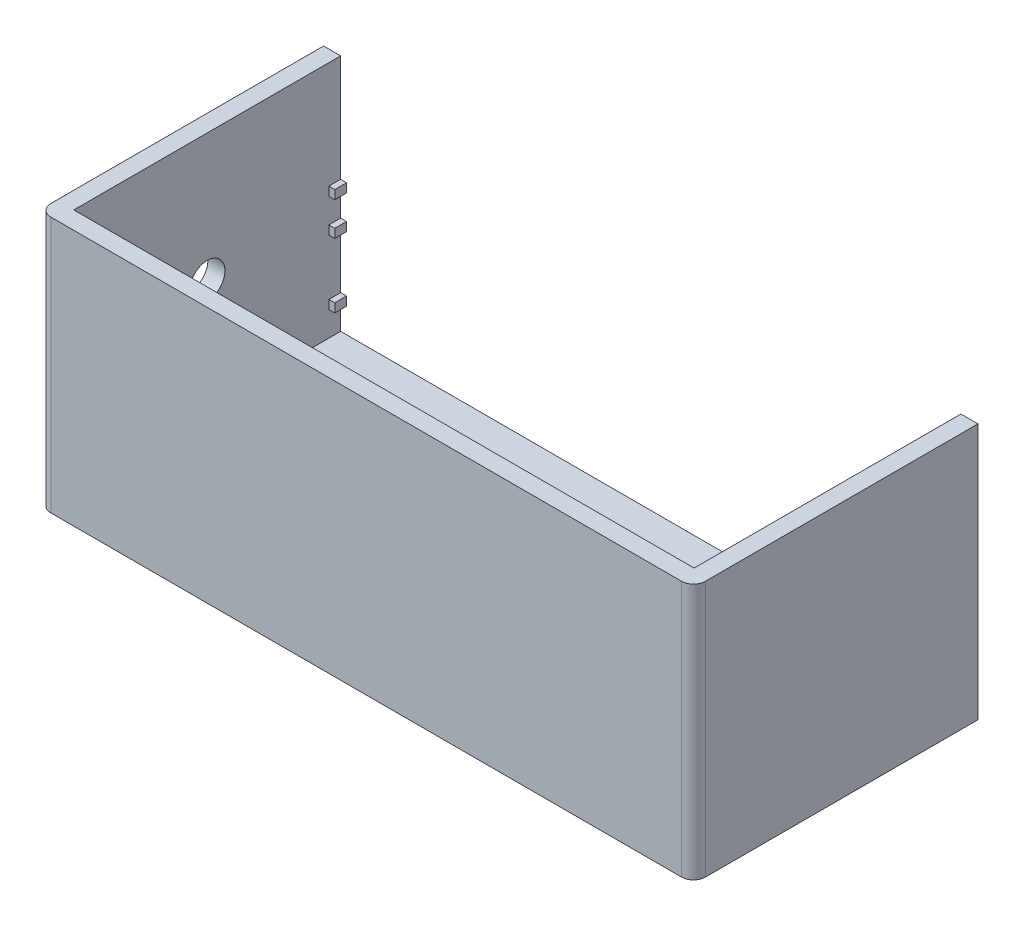
ISO-10303-21;
HEADER;
FILE_DESCRIPTION(('STEP AP214'),'2;1');
FILE_NAME('part.step','',(''),(''),'','','');
FILE_SCHEMA(('AUTOMOTIVE_DESIGN { 1 0 10303 214 1 1 1 1 }'));
ENDSEC;
DATA;
#1=APPLICATION_CONTEXT('core data for automotive mechanical design processes');
#2=APPLICATION_PROTOCOL_DEFINITION('international standard','automotive_design',2000,#1);
#3=PRODUCT_CONTEXT('',#1,'mechanical');
#4=PRODUCT('Part','Part','',(#3));
#5=PRODUCT_RELATED_PRODUCT_CATEGORY('part','',(#4));
#6=PRODUCT_DEFINITION_FORMATION('','',#4);
#7=PRODUCT_DEFINITION_CONTEXT('part definition',#1,'design');
#8=PRODUCT_DEFINITION('design','',#6,#7);
#9=PRODUCT_DEFINITION_SHAPE('','',#8);
#10=(LENGTH_UNIT() NAMED_UNIT(*) SI_UNIT(.MILLI.,.METRE.));
#11=(NAMED_UNIT(*) PLANE_ANGLE_UNIT() SI_UNIT($,.RADIAN.));
#12=(NAMED_UNIT(*) SI_UNIT($,.STERADIAN.) SOLID_ANGLE_UNIT());
#13=UNCERTAINTY_MEASURE_WITH_UNIT(LENGTH_MEASURE(1.E-05),#10,'distance_accuracy_value','');
#14=(GEOMETRIC_REPRESENTATION_CONTEXT(3) GLOBAL_UNCERTAINTY_ASSIGNED_CONTEXT((#13)) GLOBAL_UNIT_ASSIGNED_CONTEXT((#10,
#11,#12)) REPRESENTATION_CONTEXT('',''));
#15=CARTESIAN_POINT('',(0.,0.,0.));
#16=DIRECTION('',(0.,0.,1.));
#17=DIRECTION('',(1.,0.,0.));
#18=AXIS2_PLACEMENT_3D('',#15,#16,#17);
#19=CARTESIAN_POINT('',(52.65,43.5,22.65));
#20=DIRECTION('',(-1.,0.,0.));
#21=DIRECTION('',(0.,0.,1.));
#22=AXIS2_PLACEMENT_3D('',#19,#20,#21);
#23=PLANE('',#22);
#24=DIRECTION('',(0.,-1.,0.));
#25=VECTOR('',#24,1.);
#26=CARTESIAN_POINT('',(52.65,43.5,-22.65));
#27=LINE('',#26,#25);
#28=CARTESIAN_POINT('',(52.65,18.15,-22.65));
#29=VERTEX_POINT('',#28);
#30=CARTESIAN_POINT('',(52.65,8.70000000000002,-22.65));
#31=VERTEX_POINT('',#30);
#32=EDGE_CURVE('E276',#29,#31,#27,.T.);
#33=ORIENTED_EDGE('',*,*,#32,.T.);
#34=DIRECTION('',(0.,0.,-1.));
#35=VECTOR('',#34,1.);
#36=CARTESIAN_POINT('',(52.65,8.70000000000002,-20.65));
#37=LINE('',#36,#35);
#38=CARTESIAN_POINT('',(52.65,8.70000000000002,-20.65));
#39=VERTEX_POINT('',#38);
#40=EDGE_CURVE('E288',#39,#31,#37,.T.);
#41=ORIENTED_EDGE('',*,*,#40,.F.);
#42=DIRECTION('',(0.,-1.,0.));
#43=VECTOR('',#42,1.);
#44=CARTESIAN_POINT('',(52.65,8.70000000000002,-20.65));
#45=LINE('',#44,#43);
#46=CARTESIAN_POINT('',(52.65,7.20000000000001,-20.65));
#47=VERTEX_POINT('',#46);
#48=EDGE_CURVE('E284',#39,#47,#45,.T.);
#49=ORIENTED_EDGE('',*,*,#48,.T.);
#50=DIRECTION('',(0.,0.,-1.));
#51=VECTOR('',#50,1.);
#52=CARTESIAN_POINT('',(52.65,7.20000000000001,-20.65));
#53=LINE('',#52,#51);
#54=CARTESIAN_POINT('',(52.65,7.20000000000001,-22.65));
#55=VERTEX_POINT('',#54);
#56=EDGE_CURVE('E282',#47,#55,#53,.T.);
#57=ORIENTED_EDGE('',*,*,#56,.T.);
#58=CARTESIAN_POINT('',(52.65,3.,-22.65));
#59=VERTEX_POINT('',#58);
#60=EDGE_CURVE('E265',#55,#59,#27,.T.);
#61=ORIENTED_EDGE('',*,*,#60,.T.);
#62=DIRECTION('',(0.,0.,-1.));
#63=VECTOR('',#62,1.);
#64=CARTESIAN_POINT('',(52.65,3.,22.65));
#65=LINE('',#64,#63);
#66=CARTESIAN_POINT('',(52.65,3.,22.65));
#67=VERTEX_POINT('',#66);
#68=EDGE_CURVE('E484',#67,#59,#65,.T.);
#69=ORIENTED_EDGE('',*,*,#68,.F.);
#70=DIRECTION('',(0.,-1.,0.));
#71=VECTOR('',#70,1.);
#72=CARTESIAN_POINT('',(52.65,43.5,22.65));
#73=LINE('',#72,#71);
#74=CARTESIAN_POINT('',(52.65,43.5,22.65));
#75=VERTEX_POINT('',#74);
#76=EDGE_CURVE('E491',#75,#67,#73,.T.);
#77=ORIENTED_EDGE('',*,*,#76,.F.);
#78=DIRECTION('',(0.,0.,-1.));
#79=VECTOR('',#78,1.);
#80=CARTESIAN_POINT('',(52.65,43.5,22.65));
#81=LINE('',#80,#79);
#82=CARTESIAN_POINT('',(52.65,43.5,-22.65));
#83=VERTEX_POINT('',#82);
#84=EDGE_CURVE('E476',#75,#83,#81,.T.);
#85=ORIENTED_EDGE('',*,*,#84,.T.);
#86=CARTESIAN_POINT('',(52.65,25.35,-22.65));
#87=VERTEX_POINT('',#86);
#88=EDGE_CURVE('E280',#83,#87,#27,.T.);
#89=ORIENTED_EDGE('',*,*,#88,.T.);
#90=DIRECTION('',(0.,0.,-1.));
#91=VECTOR('',#90,1.);
#92=CARTESIAN_POINT('',(52.65,25.35,-20.65));
#93=LINE('',#92,#91);
#94=CARTESIAN_POINT('',(52.65,25.35,-20.65));
#95=VERTEX_POINT('',#94);
#96=EDGE_CURVE('E340',#95,#87,#93,.T.);
#97=ORIENTED_EDGE('',*,*,#96,.F.);
#98=DIRECTION('',(0.,1.,0.));
#99=VECTOR('',#98,1.);
#100=CARTESIAN_POINT('',(52.65,0.,-20.65));
#101=LINE('',#100,#99);
#102=CARTESIAN_POINT('',(52.65,23.85,-20.65));
#103=VERTEX_POINT('',#102);
#104=EDGE_CURVE('E366',#103,#95,#101,.T.);
#105=ORIENTED_EDGE('',*,*,#104,.F.);
#106=DIRECTION('',(0.,0.,-1.));
#107=VECTOR('',#106,1.);
#108=CARTESIAN_POINT('',(52.65,23.85,-20.65));
#109=LINE('',#108,#107);
#110=CARTESIAN_POINT('',(52.65,23.85,-22.65));
#111=VERTEX_POINT('',#110);
#112=EDGE_CURVE('E344',#103,#111,#109,.T.);
#113=ORIENTED_EDGE('',*,*,#112,.T.);
#114=CARTESIAN_POINT('',(52.65,19.65,-22.65));
#115=VERTEX_POINT('',#114);
#116=EDGE_CURVE('E279',#111,#115,#27,.T.);
#117=ORIENTED_EDGE('',*,*,#116,.T.);
#118=DIRECTION('',(0.,0.,-1.));
#119=VECTOR('',#118,1.);
#120=CARTESIAN_POINT('',(52.65,19.65,-20.65));
#121=LINE('',#120,#119);
#122=CARTESIAN_POINT('',(52.65,19.65,-20.65));
#123=VERTEX_POINT('',#122);
#124=EDGE_CURVE('E374',#123,#115,#121,.T.);
#125=ORIENTED_EDGE('',*,*,#124,.F.);
#126=DIRECTION('',(0.,1.,0.));
#127=VECTOR('',#126,1.);
#128=CARTESIAN_POINT('',(52.65,0.,-20.65));
#129=LINE('',#128,#127);
#130=CARTESIAN_POINT('',(52.65,18.15,-20.65));
#131=VERTEX_POINT('',#130);
#132=EDGE_CURVE('E394',#131,#123,#129,.T.);
#133=ORIENTED_EDGE('',*,*,#132,.F.);
#134=DIRECTION('',(0.,0.,-1.));
#135=VECTOR('',#134,1.);
#136=CARTESIAN_POINT('',(52.65,18.15,-20.65));
#137=LINE('',#136,#135);
#138=EDGE_CURVE('E377',#131,#29,#137,.T.);
#139=ORIENTED_EDGE('',*,*,#138,.T.);
#140=EDGE_LOOP('',(#33,#41,#49,#57,#61,#69,#77,#85,#89,#97,#105,#113,#117,#125,#133,#139));
#141=FACE_BOUND('',#140,.T.);
#142=ADVANCED_FACE('F40',(#141),#23,.T.);
#143=CARTESIAN_POINT('',(-52.65,43.5,22.65));
#144=DIRECTION('',(1.,0.,0.));
#145=DIRECTION('',(0.,0.,-1.));
#146=AXIS2_PLACEMENT_3D('',#143,#144,#145);
#147=PLANE('',#146);
#148=CARTESIAN_POINT('',(-52.65,21.75,0.));
#149=DIRECTION('',(1.,0.,0.));
#150=DIRECTION('',(0.,0.,-1.));
#151=AXIS2_PLACEMENT_3D('',#148,#149,#150);
#152=CIRCLE('',#151,3.);
#153=CARTESIAN_POINT('',(-52.65,21.75,-3.));
#154=VERTEX_POINT('',#153);
#155=EDGE_CURVE('E944',#154,#154,#152,.T.);
#156=ORIENTED_EDGE('',*,*,#155,.F.);
#157=EDGE_LOOP('',(#156));
#158=FACE_BOUND('',#157,.T.);
#159=DIRECTION('',(0.,0.,-1.));
#160=VECTOR('',#159,1.);
#161=CARTESIAN_POINT('',(-52.65,25.35,-20.65));
#162=LINE('',#161,#160);
#163=CARTESIAN_POINT('',(-52.65,25.35,-20.65));
#164=VERTEX_POINT('',#163);
#165=CARTESIAN_POINT('',(-52.65,25.35,-22.65));
#166=VERTEX_POINT('',#165);
#167=EDGE_CURVE('E306',#164,#166,#162,.T.);
#168=ORIENTED_EDGE('',*,*,#167,.T.);
#169=DIRECTION('',(0.,-1.,0.));
#170=VECTOR('',#169,1.);
#171=CARTESIAN_POINT('',(-52.65,43.5,-22.65));
#172=LINE('',#171,#170);
#173=CARTESIAN_POINT('',(-52.65,43.5,-22.65));
#174=VERTEX_POINT('',#173);
#175=EDGE_CURVE('E277',#174,#166,#172,.T.);
#176=ORIENTED_EDGE('',*,*,#175,.F.);
#177=DIRECTION('',(0.,0.,1.));
#178=VECTOR('',#177,1.);
#179=CARTESIAN_POINT('',(-52.65,43.5,22.65));
#180=LINE('',#179,#178);
#181=CARTESIAN_POINT('',(-52.65,43.5,22.65));
#182=VERTEX_POINT('',#181);
#183=EDGE_CURVE('E472',#174,#182,#180,.T.);
#184=ORIENTED_EDGE('',*,*,#183,.T.);
#185=DIRECTION('',(0.,-1.,0.));
#186=VECTOR('',#185,1.);
#187=CARTESIAN_POINT('',(-52.65,43.5,22.65));
#188=LINE('',#187,#186);
#189=CARTESIAN_POINT('',(-52.65,3.,22.65));
#190=VERTEX_POINT('',#189);
#191=EDGE_CURVE('E494',#182,#190,#188,.T.);
#192=ORIENTED_EDGE('',*,*,#191,.T.);
#193=DIRECTION('',(0.,0.,1.));
#194=VECTOR('',#193,1.);
#195=CARTESIAN_POINT('',(-52.65,3.,22.65));
#196=LINE('',#195,#194);
#197=CARTESIAN_POINT('',(-52.65,3.,-22.65));
#198=VERTEX_POINT('',#197);
#199=EDGE_CURVE('E480',#198,#190,#196,.T.);
#200=ORIENTED_EDGE('',*,*,#199,.F.);
#201=CARTESIAN_POINT('',(-52.65,7.2,-22.65));
#202=VERTEX_POINT('',#201);
#203=EDGE_CURVE('E479',#202,#198,#172,.T.);
#204=ORIENTED_EDGE('',*,*,#203,.F.);
#205=DIRECTION('',(0.,0.,-1.));
#206=VECTOR('',#205,1.);
#207=CARTESIAN_POINT('',(-52.65,7.2,-20.65));
#208=LINE('',#207,#206);
#209=CARTESIAN_POINT('',(-52.65,7.2,-20.65));
#210=VERTEX_POINT('',#209);
#211=EDGE_CURVE('E405',#210,#202,#208,.T.);
#212=ORIENTED_EDGE('',*,*,#211,.F.);
#213=DIRECTION('',(0.,-1.,0.));
#214=VECTOR('',#213,1.);
#215=CARTESIAN_POINT('',(-52.65,0.,-20.65));
#216=LINE('',#215,#214);
#217=CARTESIAN_POINT('',(-52.65,8.7,-20.65));
#218=VERTEX_POINT('',#217);
#219=EDGE_CURVE('E424',#218,#210,#216,.T.);
#220=ORIENTED_EDGE('',*,*,#219,.F.);
#221=DIRECTION('',(0.,0.,-1.));
#222=VECTOR('',#221,1.);
#223=CARTESIAN_POINT('',(-52.65,8.7,-20.65));
#224=LINE('',#223,#222);
#225=CARTESIAN_POINT('',(-52.65,8.7,-22.65));
#226=VERTEX_POINT('',#225);
#227=EDGE_CURVE('E408',#218,#226,#224,.T.);
#228=ORIENTED_EDGE('',*,*,#227,.T.);
#229=CARTESIAN_POINT('',(-52.65,18.15,-22.65));
#230=VERTEX_POINT('',#229);
#231=EDGE_CURVE('E489',#230,#226,#172,.T.);
#232=ORIENTED_EDGE('',*,*,#231,.F.);
#233=DIRECTION('',(0.,0.,-1.));
#234=VECTOR('',#233,1.);
#235=CARTESIAN_POINT('',(-52.65,18.15,-20.65));
#236=LINE('',#235,#234);
#237=CARTESIAN_POINT('',(-52.65,18.15,-20.65));
#238=VERTEX_POINT('',#237);
#239=EDGE_CURVE('E441',#238,#230,#236,.T.);
#240=ORIENTED_EDGE('',*,*,#239,.F.);
#241=DIRECTION('',(0.,-1.,0.));
#242=VECTOR('',#241,1.);
#243=CARTESIAN_POINT('',(-52.65,0.,-20.65));
#244=LINE('',#243,#242);
#245=CARTESIAN_POINT('',(-52.65,19.65,-20.65));
#246=VERTEX_POINT('',#245);
#247=EDGE_CURVE('E434',#246,#238,#244,.T.);
#248=ORIENTED_EDGE('',*,*,#247,.F.);
#249=DIRECTION('',(0.,0.,-1.));
#250=VECTOR('',#249,1.);
#251=CARTESIAN_POINT('',(-52.65,19.65,-20.65));
#252=LINE('',#251,#250);
#253=CARTESIAN_POINT('',(-52.65,19.65,-22.65));
#254=VERTEX_POINT('',#253);
#255=EDGE_CURVE('E455',#246,#254,#252,.T.);
#256=ORIENTED_EDGE('',*,*,#255,.T.);
#257=CARTESIAN_POINT('',(-52.65,23.85,-22.65));
#258=VERTEX_POINT('',#257);
#259=EDGE_CURVE('E488',#258,#254,#172,.T.);
#260=ORIENTED_EDGE('',*,*,#259,.F.);
#261=DIRECTION('',(0.,0.,-1.));
#262=VECTOR('',#261,1.);
#263=CARTESIAN_POINT('',(-52.65,23.85,-20.65));
#264=LINE('',#263,#262);
#265=CARTESIAN_POINT('',(-52.65,23.85,-20.65));
#266=VERTEX_POINT('',#265);
#267=EDGE_CURVE('E316',#266,#258,#264,.T.);
#268=ORIENTED_EDGE('',*,*,#267,.F.);
#269=DIRECTION('',(0.,1.,0.));
#270=VECTOR('',#269,1.);
#271=CARTESIAN_POINT('',(-52.65,23.85,-20.65));
#272=LINE('',#271,#270);
#273=EDGE_CURVE('E313',#266,#164,#272,.T.);
#274=ORIENTED_EDGE('',*,*,#273,.T.);
#275=EDGE_LOOP('',(#168,#176,#184,#192,#200,#204,#212,#220,#228,#232,#240,#248,#256,#260,#268,#274));
#276=FACE_BOUND('',#275,.T.);
#277=ADVANCED_FACE('F541',(#158,#276),#147,.T.);
#278=CARTESIAN_POINT('',(-55.55,3.,25.65));
#279=DIRECTION('',(1.,0.,0.));
#280=DIRECTION('',(0.,0.,-1.));
#281=AXIS2_PLACEMENT_3D('',#278,#279,#280);
#282=PLANE('',#281);
#283=CARTESIAN_POINT('',(-55.55,21.75,0.));
#284=DIRECTION('',(1.,0.,0.));
#285=DIRECTION('',(0.,0.,-1.));
#286=AXIS2_PLACEMENT_3D('',#283,#284,#285);
#287=CIRCLE('',#286,3.);
#288=CARTESIAN_POINT('',(-55.55,21.75,-3.));
#289=VERTEX_POINT('',#288);
#290=EDGE_CURVE('E44',#289,#289,#287,.T.);
#291=ORIENTED_EDGE('',*,*,#290,.T.);
#292=EDGE_LOOP('',(#291));
#293=FACE_BOUND('',#292,.T.);
#294=DIRECTION('',(0.,0.,1.));
#295=VECTOR('',#294,1.);
#296=CARTESIAN_POINT('',(-55.55,0.,25.65));
#297=LINE('',#296,#295);
#298=CARTESIAN_POINT('',(-55.55,0.,-22.65));
#299=VERTEX_POINT('',#298);
#300=CARTESIAN_POINT('',(-55.55,0.,23.65));
#301=VERTEX_POINT('',#300);
#302=EDGE_CURVE('E503',#299,#301,#297,.T.);
#303=ORIENTED_EDGE('',*,*,#302,.T.);
#304=DIRECTION('',(0.,-1.,0.));
#305=VECTOR('',#304,1.);
#306=CARTESIAN_POINT('',(-55.55,3.,23.65));
#307=LINE('',#306,#305);
#308=CARTESIAN_POINT('',(-55.55,43.5,23.65));
#309=VERTEX_POINT('',#308);
#310=EDGE_CURVE('E64',#301,#309,#307,.F.);
#311=ORIENTED_EDGE('',*,*,#310,.T.);
#312=DIRECTION('',(0.,0.,1.));
#313=VECTOR('',#312,1.);
#314=CARTESIAN_POINT('',(-55.55,43.5,-25.65));
#315=LINE('',#314,#313);
#316=CARTESIAN_POINT('',(-55.55,43.5,-22.65));
#317=VERTEX_POINT('',#316);
#318=EDGE_CURVE('E497',#317,#309,#315,.T.);
#319=ORIENTED_EDGE('',*,*,#318,.F.);
#320=DIRECTION('',(0.,-1.,0.));
#321=VECTOR('',#320,1.);
#322=CARTESIAN_POINT('',(-55.55,3.,-22.65));
#323=LINE('',#322,#321);
#324=EDGE_CURVE('E462',#317,#299,#323,.T.);
#325=ORIENTED_EDGE('',*,*,#324,.T.);
#326=EDGE_LOOP('',(#303,#311,#319,#325));
#327=FACE_BOUND('',#326,.T.);
#328=ADVANCED_FACE('F534',(#293,#327),#282,.F.);
#329=CARTESIAN_POINT('',(55.55,3.,25.65));
#330=DIRECTION('',(0.,0.,-1.));
#331=DIRECTION('',(-1.,0.,0.));
#332=AXIS2_PLACEMENT_3D('',#329,#330,#331);
#333=PLANE('',#332);
#334=DIRECTION('',(1.,0.,0.));
#335=VECTOR('',#334,1.);
#336=CARTESIAN_POINT('',(55.55,43.5,25.65));
#337=LINE('',#336,#335);
#338=CARTESIAN_POINT('',(-53.55,43.5,25.65));
#339=VERTEX_POINT('',#338);
#340=CARTESIAN_POINT('',(53.55,43.5,25.65));
#341=VERTEX_POINT('',#340);
#342=EDGE_CURVE('E499',#339,#341,#337,.T.);
#343=ORIENTED_EDGE('',*,*,#342,.F.);
#344=DIRECTION('',(0.,-1.,0.));
#345=VECTOR('',#344,1.);
#346=CARTESIAN_POINT('',(-53.55,3.,25.65));
#347=LINE('',#346,#345);
#348=CARTESIAN_POINT('',(-53.55,0.,25.65));
#349=VERTEX_POINT('',#348);
#350=EDGE_CURVE('E512',#339,#349,#347,.T.);
#351=ORIENTED_EDGE('',*,*,#350,.T.);
#352=DIRECTION('',(1.,0.,0.));
#353=VECTOR('',#352,1.);
#354=CARTESIAN_POINT('',(55.55,0.,25.65));
#355=LINE('',#354,#353);
#356=CARTESIAN_POINT('',(53.55,0.,25.65));
#357=VERTEX_POINT('',#356);
#358=EDGE_CURVE('E505',#349,#357,#355,.T.);
#359=ORIENTED_EDGE('',*,*,#358,.T.);
#360=DIRECTION('',(0.,-1.,0.));
#361=VECTOR('',#360,1.);
#362=CARTESIAN_POINT('',(53.55,3.,25.65));
#363=LINE('',#362,#361);
#364=EDGE_CURVE('E510',#357,#341,#363,.F.);
#365=ORIENTED_EDGE('',*,*,#364,.T.);
#366=EDGE_LOOP('',(#343,#351,#359,#365));
#367=FACE_BOUND('',#366,.T.);
#368=ADVANCED_FACE('F527',(#367),#333,.F.);
#369=CARTESIAN_POINT('',(55.55,3.,25.65));
#370=DIRECTION('',(-1.,0.,0.));
#371=DIRECTION('',(0.,0.,1.));
#372=AXIS2_PLACEMENT_3D('',#369,#370,#371);
#373=PLANE('',#372);
#374=DIRECTION('',(0.,0.,-1.));
#375=VECTOR('',#374,1.);
#376=CARTESIAN_POINT('',(55.55,43.5,-25.65));
#377=LINE('',#376,#375);
#378=CARTESIAN_POINT('',(55.55,43.5,23.65));
#379=VERTEX_POINT('',#378);
#380=CARTESIAN_POINT('',(55.55,43.5,-22.65));
#381=VERTEX_POINT('',#380);
#382=EDGE_CURVE('E501',#379,#381,#377,.T.);
#383=ORIENTED_EDGE('',*,*,#382,.F.);
#384=DIRECTION('',(0.,-1.,0.));
#385=VECTOR('',#384,1.);
#386=CARTESIAN_POINT('',(55.55,3.,23.65));
#387=LINE('',#386,#385);
#388=CARTESIAN_POINT('',(55.55,0.,23.65));
#389=VERTEX_POINT('',#388);
#390=EDGE_CURVE('E11',#379,#389,#387,.T.);
#391=ORIENTED_EDGE('',*,*,#390,.T.);
#392=DIRECTION('',(0.,0.,-1.));
#393=VECTOR('',#392,1.);
#394=CARTESIAN_POINT('',(55.55,0.,25.65));
#395=LINE('',#394,#393);
#396=CARTESIAN_POINT('',(55.55,0.,-22.65));
#397=VERTEX_POINT('',#396);
#398=EDGE_CURVE('E508',#389,#397,#395,.T.);
#399=ORIENTED_EDGE('',*,*,#398,.T.);
#400=DIRECTION('',(0.,1.,0.));
#401=VECTOR('',#400,1.);
#402=CARTESIAN_POINT('',(55.55,3.,-22.65));
#403=LINE('',#402,#401);
#404=EDGE_CURVE('E469',#397,#381,#403,.T.);
#405=ORIENTED_EDGE('',*,*,#404,.T.);
#406=EDGE_LOOP('',(#383,#391,#399,#405));
#407=FACE_BOUND('',#406,.T.);
#408=ADVANCED_FACE('F614',(#407),#373,.F.);
#409=CARTESIAN_POINT('',(0.,0.,0.));
#410=DIRECTION('',(0.,1.,0.));
#411=DIRECTION('',(0.,0.,1.));
#412=AXIS2_PLACEMENT_3D('',#409,#410,#411);
#413=PLANE('',#412);
#414=ORIENTED_EDGE('',*,*,#358,.F.);
#415=CARTESIAN_POINT('',(-53.55,0.,23.65));
#416=DIRECTION('',(0.,1.,0.));
#417=DIRECTION('',(0.,0.,1.));
#418=AXIS2_PLACEMENT_3D('',#415,#416,#417);
#419=CIRCLE('',#418,2.);
#420=EDGE_CURVE('E517',#349,#301,#419,.F.);
#421=ORIENTED_EDGE('',*,*,#420,.T.);
#422=ORIENTED_EDGE('',*,*,#302,.F.);
#423=DIRECTION('',(1.,0.,0.));
#424=VECTOR('',#423,1.);
#425=CARTESIAN_POINT('',(0.,0.,-22.65));
#426=LINE('',#425,#424);
#427=EDGE_CURVE('E466',#299,#397,#426,.T.);
#428=ORIENTED_EDGE('',*,*,#427,.T.);
#429=ORIENTED_EDGE('',*,*,#398,.F.);
#430=CARTESIAN_POINT('',(53.55,0.,23.65));
#431=DIRECTION('',(0.,1.,0.));
#432=DIRECTION('',(0.,0.,1.));
#433=AXIS2_PLACEMENT_3D('',#430,#431,#432);
#434=CIRCLE('',#433,2.);
#435=EDGE_CURVE('E515',#389,#357,#434,.F.);
#436=ORIENTED_EDGE('',*,*,#435,.T.);
#437=EDGE_LOOP('',(#414,#421,#422,#428,#429,#436));
#438=FACE_BOUND('',#437,.T.);
#439=ADVANCED_FACE('F533',(#438),#413,.F.);
#440=CARTESIAN_POINT('',(0.,43.5,0.));
#441=DIRECTION('',(0.,-1.,0.));
#442=DIRECTION('',(0.,0.,-1.));
#443=AXIS2_PLACEMENT_3D('',#440,#441,#442);
#444=PLANE('',#443);
#445=ORIENTED_EDGE('',*,*,#318,.T.);
#446=CARTESIAN_POINT('',(-53.55,43.5,23.65));
#447=DIRECTION('',(0.,-1.,0.));
#448=DIRECTION('',(0.,0.,-1.));
#449=AXIS2_PLACEMENT_3D('',#446,#447,#448);
#450=CIRCLE('',#449,2.);
#451=EDGE_CURVE('E49',#309,#339,#450,.F.);
#452=ORIENTED_EDGE('',*,*,#451,.T.);
#453=ORIENTED_EDGE('',*,*,#342,.T.);
#454=CARTESIAN_POINT('',(53.55,43.5,23.65));
#455=DIRECTION('',(0.,-1.,0.));
#456=DIRECTION('',(0.,0.,-1.));
#457=AXIS2_PLACEMENT_3D('',#454,#455,#456);
#458=CIRCLE('',#457,2.);
#459=EDGE_CURVE('E56',#341,#379,#458,.F.);
#460=ORIENTED_EDGE('',*,*,#459,.T.);
#461=ORIENTED_EDGE('',*,*,#382,.T.);
#462=DIRECTION('',(-1.,0.,0.));
#463=VECTOR('',#462,1.);
#464=CARTESIAN_POINT('',(0.,43.5,-22.65));
#465=LINE('',#464,#463);
#466=EDGE_CURVE('E463',#381,#83,#465,.T.);
#467=ORIENTED_EDGE('',*,*,#466,.T.);
#468=ORIENTED_EDGE('',*,*,#84,.F.);
#469=DIRECTION('',(1.,0.,0.));
#470=VECTOR('',#469,1.);
#471=CARTESIAN_POINT('',(52.65,43.5,22.65));
#472=LINE('',#471,#470);
#473=EDGE_CURVE('E474',#182,#75,#472,.T.);
#474=ORIENTED_EDGE('',*,*,#473,.F.);
#475=ORIENTED_EDGE('',*,*,#183,.F.);
#476=EDGE_CURVE('E451',#174,#317,#465,.T.);
#477=ORIENTED_EDGE('',*,*,#476,.T.);
#478=EDGE_LOOP('',(#445,#452,#453,#460,#461,#467,#468,#474,#475,#477));
#479=FACE_BOUND('',#478,.T.);
#480=ADVANCED_FACE('F523',(#479),#444,.F.);
#481=CARTESIAN_POINT('',(52.65,43.5,22.65));
#482=DIRECTION('',(0.,0.,-1.));
#483=DIRECTION('',(-1.,0.,0.));
#484=AXIS2_PLACEMENT_3D('',#481,#482,#483);
#485=PLANE('',#484);
#486=DIRECTION('',(1.,0.,0.));
#487=VECTOR('',#486,1.);
#488=CARTESIAN_POINT('',(52.65,3.,22.65));
#489=LINE('',#488,#487);
#490=EDGE_CURVE('E482',#190,#67,#489,.T.);
#491=ORIENTED_EDGE('',*,*,#490,.F.);
#492=ORIENTED_EDGE('',*,*,#191,.F.);
#493=ORIENTED_EDGE('',*,*,#473,.T.);
#494=ORIENTED_EDGE('',*,*,#76,.T.);
#495=EDGE_LOOP('',(#491,#492,#493,#494));
#496=FACE_BOUND('',#495,.T.);
#497=ADVANCED_FACE('F545',(#496),#485,.T.);
#498=CARTESIAN_POINT('',(0.,3.,0.));
#499=DIRECTION('',(0.,1.,0.));
#500=DIRECTION('',(0.,0.,1.));
#501=AXIS2_PLACEMENT_3D('',#498,#499,#500);
#502=PLANE('',#501);
#503=ORIENTED_EDGE('',*,*,#199,.T.);
#504=ORIENTED_EDGE('',*,*,#490,.T.);
#505=ORIENTED_EDGE('',*,*,#68,.T.);
#506=DIRECTION('',(-1.,0.,0.));
#507=VECTOR('',#506,1.);
#508=CARTESIAN_POINT('',(52.65,3.,-22.65));
#509=LINE('',#508,#507);
#510=EDGE_CURVE('E272',#59,#198,#509,.T.);
#511=ORIENTED_EDGE('',*,*,#510,.T.);
#512=EDGE_LOOP('',(#503,#504,#505,#511));
#513=FACE_BOUND('',#512,.T.);
#514=ADVANCED_FACE('F548',(#513),#502,.T.);
#515=CARTESIAN_POINT('',(0.,0.,-22.65));
#516=DIRECTION('',(0.,0.,1.));
#517=DIRECTION('',(1.,0.,0.));
#518=AXIS2_PLACEMENT_3D('',#515,#516,#517);
#519=PLANE('',#518);
#520=ORIENTED_EDGE('',*,*,#404,.F.);
#521=ORIENTED_EDGE('',*,*,#427,.F.);
#522=ORIENTED_EDGE('',*,*,#324,.F.);
#523=ORIENTED_EDGE('',*,*,#476,.F.);
#524=ORIENTED_EDGE('',*,*,#175,.T.);
#525=DIRECTION('',(1.,0.,0.));
#526=VECTOR('',#525,1.);
#527=CARTESIAN_POINT('',(-52.65,25.35,-22.65));
#528=LINE('',#527,#526);
#529=CARTESIAN_POINT('',(-51.65,25.35,-22.65));
#530=VERTEX_POINT('',#529);
#531=EDGE_CURVE('E327',#166,#530,#528,.T.);
#532=ORIENTED_EDGE('',*,*,#531,.T.);
#533=DIRECTION('',(0.,-1.,0.));
#534=VECTOR('',#533,1.);
#535=CARTESIAN_POINT('',(-51.65,25.35,-22.65));
#536=LINE('',#535,#534);
#537=CARTESIAN_POINT('',(-51.65,23.85,-22.65));
#538=VERTEX_POINT('',#537);
#539=EDGE_CURVE('E323',#530,#538,#536,.T.);
#540=ORIENTED_EDGE('',*,*,#539,.T.);
#541=DIRECTION('',(-1.,0.,0.));
#542=VECTOR('',#541,1.);
#543=CARTESIAN_POINT('',(-51.65,23.85,-22.65));
#544=LINE('',#543,#542);
#545=EDGE_CURVE('E321',#538,#258,#544,.T.);
#546=ORIENTED_EDGE('',*,*,#545,.T.);
#547=ORIENTED_EDGE('',*,*,#259,.T.);
#548=DIRECTION('',(-1.,0.,0.));
#549=VECTOR('',#548,1.);
#550=CARTESIAN_POINT('',(0.,19.65,-22.65));
#551=LINE('',#550,#549);
#552=CARTESIAN_POINT('',(-51.65,19.65,-22.65));
#553=VERTEX_POINT('',#552);
#554=EDGE_CURVE('E444',#553,#254,#551,.T.);
#555=ORIENTED_EDGE('',*,*,#554,.F.);
#556=DIRECTION('',(0.,1.,0.));
#557=VECTOR('',#556,1.);
#558=CARTESIAN_POINT('',(-51.65,0.,-22.65));
#559=LINE('',#558,#557);
#560=CARTESIAN_POINT('',(-51.65,18.15,-22.65));
#561=VERTEX_POINT('',#560);
#562=EDGE_CURVE('E435',#561,#553,#559,.T.);
#563=ORIENTED_EDGE('',*,*,#562,.F.);
#564=DIRECTION('',(1.,0.,0.));
#565=VECTOR('',#564,1.);
#566=CARTESIAN_POINT('',(0.,18.15,-22.65));
#567=LINE('',#566,#565);
#568=EDGE_CURVE('E421',#230,#561,#567,.T.);
#569=ORIENTED_EDGE('',*,*,#568,.F.);
#570=ORIENTED_EDGE('',*,*,#231,.T.);
#571=DIRECTION('',(1.,0.,0.));
#572=VECTOR('',#571,1.);
#573=CARTESIAN_POINT('',(0.,8.69999999999982,-22.65));
#574=LINE('',#573,#572);
#575=CARTESIAN_POINT('',(-51.65,8.7,-22.65));
#576=VERTEX_POINT('',#575);
#577=EDGE_CURVE('E412',#226,#576,#574,.T.);
#578=ORIENTED_EDGE('',*,*,#577,.T.);
#579=DIRECTION('',(0.,-1.,0.));
#580=VECTOR('',#579,1.);
#581=CARTESIAN_POINT('',(-51.65,-2.38929246757872E-13,-22.65));
#582=LINE('',#581,#580);
#583=CARTESIAN_POINT('',(-51.65,7.2,-22.65));
#584=VERTEX_POINT('',#583);
#585=EDGE_CURVE('E418',#576,#584,#582,.T.);
#586=ORIENTED_EDGE('',*,*,#585,.T.);
#587=DIRECTION('',(-1.,0.,0.));
#588=VECTOR('',#587,1.);
#589=CARTESIAN_POINT('',(0.,7.20000000000018,-22.65));
#590=LINE('',#589,#588);
#591=EDGE_CURVE('E415',#584,#202,#590,.T.);
#592=ORIENTED_EDGE('',*,*,#591,.T.);
#593=ORIENTED_EDGE('',*,*,#203,.T.);
#594=ORIENTED_EDGE('',*,*,#510,.F.);
#595=ORIENTED_EDGE('',*,*,#60,.F.);
#596=DIRECTION('',(1.,0.,0.));
#597=VECTOR('',#596,1.);
#598=CARTESIAN_POINT('',(51.65,7.20000000000002,-22.65));
#599=LINE('',#598,#597);
#600=CARTESIAN_POINT('',(51.65,7.20000000000002,-22.65));
#601=VERTEX_POINT('',#600);
#602=EDGE_CURVE('E270',#601,#55,#599,.T.);
#603=ORIENTED_EDGE('',*,*,#602,.F.);
#604=DIRECTION('',(0.,-1.,0.));
#605=VECTOR('',#604,1.);
#606=CARTESIAN_POINT('',(51.65,8.70000000000002,-22.65));
#607=LINE('',#606,#605);
#608=CARTESIAN_POINT('',(51.65,8.70000000000002,-22.65));
#609=VERTEX_POINT('',#608);
#610=EDGE_CURVE('E294',#609,#601,#607,.T.);
#611=ORIENTED_EDGE('',*,*,#610,.F.);
#612=DIRECTION('',(-1.,0.,0.));
#613=VECTOR('',#612,1.);
#614=CARTESIAN_POINT('',(52.65,8.70000000000002,-22.65));
#615=LINE('',#614,#613);
#616=EDGE_CURVE('E297',#31,#609,#615,.T.);
#617=ORIENTED_EDGE('',*,*,#616,.F.);
#618=ORIENTED_EDGE('',*,*,#32,.F.);
#619=DIRECTION('',(-1.,0.,0.));
#620=VECTOR('',#619,1.);
#621=CARTESIAN_POINT('',(0.,18.15,-22.65));
#622=LINE('',#621,#620);
#623=CARTESIAN_POINT('',(51.65,18.15,-22.65));
#624=VERTEX_POINT('',#623);
#625=EDGE_CURVE('E381',#29,#624,#622,.T.);
#626=ORIENTED_EDGE('',*,*,#625,.T.);
#627=DIRECTION('',(0.,1.,0.));
#628=VECTOR('',#627,1.);
#629=CARTESIAN_POINT('',(51.65,0.,-22.65));
#630=LINE('',#629,#628);
#631=CARTESIAN_POINT('',(51.65,19.65,-22.65));
#632=VERTEX_POINT('',#631);
#633=EDGE_CURVE('E388',#624,#632,#630,.T.);
#634=ORIENTED_EDGE('',*,*,#633,.T.);
#635=DIRECTION('',(1.,0.,0.));
#636=VECTOR('',#635,1.);
#637=CARTESIAN_POINT('',(0.,19.65,-22.65));
#638=LINE('',#637,#636);
#639=EDGE_CURVE('E384',#632,#115,#638,.T.);
#640=ORIENTED_EDGE('',*,*,#639,.T.);
#641=ORIENTED_EDGE('',*,*,#116,.F.);
#642=DIRECTION('',(1.,0.,0.));
#643=VECTOR('',#642,1.);
#644=CARTESIAN_POINT('',(0.,23.85,-22.65));
#645=LINE('',#644,#643);
#646=CARTESIAN_POINT('',(51.65,23.85,-22.65));
#647=VERTEX_POINT('',#646);
#648=EDGE_CURVE('E354',#647,#111,#645,.T.);
#649=ORIENTED_EDGE('',*,*,#648,.F.);
#650=DIRECTION('',(0.,-1.,0.));
#651=VECTOR('',#650,1.);
#652=CARTESIAN_POINT('',(51.65,0.,-22.65));
#653=LINE('',#652,#651);
#654=CARTESIAN_POINT('',(51.65,25.35,-22.65));
#655=VERTEX_POINT('',#654);
#656=EDGE_CURVE('E352',#655,#647,#653,.T.);
#657=ORIENTED_EDGE('',*,*,#656,.F.);
#658=DIRECTION('',(-1.,0.,0.));
#659=VECTOR('',#658,1.);
#660=CARTESIAN_POINT('',(0.,25.35,-22.65));
#661=LINE('',#660,#659);
#662=EDGE_CURVE('E358',#87,#655,#661,.T.);
#663=ORIENTED_EDGE('',*,*,#662,.F.);
#664=ORIENTED_EDGE('',*,*,#88,.F.);
#665=ORIENTED_EDGE('',*,*,#466,.F.);
#666=EDGE_LOOP('',(#520,#521,#522,#523,#524,#532,#540,#546,#547,#555,#563,#569,#570,#578,#586,
#592,#593,#594,#595,#603,#611,#617,#618,#626,#634,#640,#641,#649,#657,#663,#664,#665));
#667=FACE_BOUND('',#666,.T.);
#668=ADVANCED_FACE('F268',(#667),#519,.F.);
#669=CARTESIAN_POINT('',(0.,18.15,-20.65));
#670=DIRECTION('',(0.,1.,0.));
#671=DIRECTION('',(0.,0.,1.));
#672=AXIS2_PLACEMENT_3D('',#669,#670,#671);
#673=PLANE('',#672);
#674=ORIENTED_EDGE('',*,*,#568,.T.);
#675=DIRECTION('',(0.,0.,-1.));
#676=VECTOR('',#675,1.);
#677=CARTESIAN_POINT('',(-51.65,18.15,-20.65));
#678=LINE('',#677,#676);
#679=CARTESIAN_POINT('',(-51.65,18.15,-20.65));
#680=VERTEX_POINT('',#679);
#681=EDGE_CURVE('E448',#680,#561,#678,.T.);
#682=ORIENTED_EDGE('',*,*,#681,.F.);
#683=DIRECTION('',(1.,0.,0.));
#684=VECTOR('',#683,1.);
#685=CARTESIAN_POINT('',(0.,18.15,-20.65));
#686=LINE('',#685,#684);
#687=EDGE_CURVE('E431',#238,#680,#686,.T.);
#688=ORIENTED_EDGE('',*,*,#687,.F.);
#689=ORIENTED_EDGE('',*,*,#239,.T.);
#690=EDGE_LOOP('',(#674,#682,#688,#689));
#691=FACE_BOUND('',#690,.T.);
#692=ADVANCED_FACE('F570',(#691),#673,.F.);
#693=CARTESIAN_POINT('',(-51.65,0.,-20.65));
#694=DIRECTION('',(-1.,0.,0.));
#695=DIRECTION('',(0.,0.,1.));
#696=AXIS2_PLACEMENT_3D('',#693,#694,#695);
#697=PLANE('',#696);
#698=ORIENTED_EDGE('',*,*,#562,.T.);
#699=DIRECTION('',(0.,0.,-1.));
#700=VECTOR('',#699,1.);
#701=CARTESIAN_POINT('',(-51.65,19.65,-20.65));
#702=LINE('',#701,#700);
#703=CARTESIAN_POINT('',(-51.65,19.65,-20.65));
#704=VERTEX_POINT('',#703);
#705=EDGE_CURVE('E452',#704,#553,#702,.T.);
#706=ORIENTED_EDGE('',*,*,#705,.F.);
#707=DIRECTION('',(0.,1.,0.));
#708=VECTOR('',#707,1.);
#709=CARTESIAN_POINT('',(-51.65,0.,-20.65));
#710=LINE('',#709,#708);
#711=EDGE_CURVE('E439',#680,#704,#710,.T.);
#712=ORIENTED_EDGE('',*,*,#711,.F.);
#713=ORIENTED_EDGE('',*,*,#681,.T.);
#714=EDGE_LOOP('',(#698,#706,#712,#713));
#715=FACE_BOUND('',#714,.T.);
#716=ADVANCED_FACE('F572',(#715),#697,.F.);
#717=CARTESIAN_POINT('',(0.,19.65,-20.65));
#718=DIRECTION('',(0.,-1.,0.));
#719=DIRECTION('',(0.,0.,-1.));
#720=AXIS2_PLACEMENT_3D('',#717,#718,#719);
#721=PLANE('',#720);
#722=ORIENTED_EDGE('',*,*,#554,.T.);
#723=ORIENTED_EDGE('',*,*,#255,.F.);
#724=DIRECTION('',(-1.,0.,0.));
#725=VECTOR('',#724,1.);
#726=CARTESIAN_POINT('',(0.,19.65,-20.65));
#727=LINE('',#726,#725);
#728=EDGE_CURVE('E437',#704,#246,#727,.T.);
#729=ORIENTED_EDGE('',*,*,#728,.F.);
#730=ORIENTED_EDGE('',*,*,#705,.T.);
#731=EDGE_LOOP('',(#722,#723,#729,#730));
#732=FACE_BOUND('',#731,.T.);
#733=ADVANCED_FACE('F559',(#732),#721,.F.);
#734=CARTESIAN_POINT('',(0.,0.,-20.65));
#735=DIRECTION('',(0.,0.,-1.));
#736=DIRECTION('',(-1.,0.,0.));
#737=AXIS2_PLACEMENT_3D('',#734,#735,#736);
#738=PLANE('',#737);
#739=ORIENTED_EDGE('',*,*,#687,.T.);
#740=ORIENTED_EDGE('',*,*,#711,.T.);
#741=ORIENTED_EDGE('',*,*,#728,.T.);
#742=ORIENTED_EDGE('',*,*,#247,.T.);
#743=EDGE_LOOP('',(#739,#740,#741,#742));
#744=FACE_BOUND('',#743,.T.);
#745=ADVANCED_FACE('F567',(#744),#738,.F.);
#746=CARTESIAN_POINT('',(-51.65,-2.38929246757872E-13,-20.65));
#747=DIRECTION('',(1.,0.,0.));
#748=DIRECTION('',(0.,1.,0.));
#749=AXIS2_PLACEMENT_3D('',#746,#747,#748);
#750=PLANE('',#749);
#751=ORIENTED_EDGE('',*,*,#585,.F.);
#752=DIRECTION('',(0.,0.,-1.));
#753=VECTOR('',#752,1.);
#754=CARTESIAN_POINT('',(-51.65,8.7,-20.65));
#755=LINE('',#754,#753);
#756=CARTESIAN_POINT('',(-51.65,8.7,-20.65));
#757=VERTEX_POINT('',#756);
#758=EDGE_CURVE('E391',#757,#576,#755,.T.);
#759=ORIENTED_EDGE('',*,*,#758,.F.);
#760=DIRECTION('',(0.,-1.,0.));
#761=VECTOR('',#760,1.);
#762=CARTESIAN_POINT('',(-51.65,-2.38929246757872E-13,-20.65));
#763=LINE('',#762,#761);
#764=CARTESIAN_POINT('',(-51.65,7.2,-20.65));
#765=VERTEX_POINT('',#764);
#766=EDGE_CURVE('E416',#757,#765,#763,.T.);
#767=ORIENTED_EDGE('',*,*,#766,.T.);
#768=DIRECTION('',(0.,0.,-1.));
#769=VECTOR('',#768,1.);
#770=CARTESIAN_POINT('',(-51.65,7.2,-20.65));
#771=LINE('',#770,#769);
#772=EDGE_CURVE('E402',#765,#584,#771,.T.);
#773=ORIENTED_EDGE('',*,*,#772,.T.);
#774=EDGE_LOOP('',(#751,#759,#767,#773));
#775=FACE_BOUND('',#774,.T.);
#776=ADVANCED_FACE('F582',(#775),#750,.T.);
#777=CARTESIAN_POINT('',(0.,8.69999999999982,-20.65));
#778=DIRECTION('',(0.,1.,0.));
#779=DIRECTION('',(-1.,0.,0.));
#780=AXIS2_PLACEMENT_3D('',#777,#778,#779);
#781=PLANE('',#780);
#782=ORIENTED_EDGE('',*,*,#577,.F.);
#783=ORIENTED_EDGE('',*,*,#227,.F.);
#784=DIRECTION('',(1.,0.,0.));
#785=VECTOR('',#784,1.);
#786=CARTESIAN_POINT('',(0.,8.69999999999982,-20.65));
#787=LINE('',#786,#785);
#788=EDGE_CURVE('E404',#218,#757,#787,.T.);
#789=ORIENTED_EDGE('',*,*,#788,.T.);
#790=ORIENTED_EDGE('',*,*,#758,.T.);
#791=EDGE_LOOP('',(#782,#783,#789,#790));
#792=FACE_BOUND('',#791,.T.);
#793=ADVANCED_FACE('F575',(#792),#781,.T.);
#794=CARTESIAN_POINT('',(0.,7.20000000000018,-20.65));
#795=DIRECTION('',(0.,-1.,0.));
#796=DIRECTION('',(1.,0.,0.));
#797=AXIS2_PLACEMENT_3D('',#794,#795,#796);
#798=PLANE('',#797);
#799=ORIENTED_EDGE('',*,*,#591,.F.);
#800=ORIENTED_EDGE('',*,*,#772,.F.);
#801=DIRECTION('',(-1.,0.,0.));
#802=VECTOR('',#801,1.);
#803=CARTESIAN_POINT('',(0.,7.20000000000018,-20.65));
#804=LINE('',#803,#802);
#805=EDGE_CURVE('E426',#765,#210,#804,.T.);
#806=ORIENTED_EDGE('',*,*,#805,.T.);
#807=ORIENTED_EDGE('',*,*,#211,.T.);
#808=EDGE_LOOP('',(#799,#800,#806,#807));
#809=FACE_BOUND('',#808,.T.);
#810=ADVANCED_FACE('F585',(#809),#798,.T.);
#811=CARTESIAN_POINT('',(0.,0.,-20.65));
#812=DIRECTION('',(0.,0.,-1.));
#813=DIRECTION('',(-1.,0.,0.));
#814=AXIS2_PLACEMENT_3D('',#811,#812,#813);
#815=PLANE('',#814);
#816=ORIENTED_EDGE('',*,*,#766,.F.);
#817=ORIENTED_EDGE('',*,*,#788,.F.);
#818=ORIENTED_EDGE('',*,*,#219,.T.);
#819=ORIENTED_EDGE('',*,*,#805,.F.);
#820=EDGE_LOOP('',(#816,#817,#818,#819));
#821=FACE_BOUND('',#820,.T.);
#822=ADVANCED_FACE('F578',(#821),#815,.F.);
#823=CARTESIAN_POINT('',(51.65,0.,-20.65));
#824=DIRECTION('',(-1.,0.,0.));
#825=DIRECTION('',(0.,0.,1.));
#826=AXIS2_PLACEMENT_3D('',#823,#824,#825);
#827=PLANE('',#826);
#828=ORIENTED_EDGE('',*,*,#633,.F.);
#829=DIRECTION('',(0.,0.,-1.));
#830=VECTOR('',#829,1.);
#831=CARTESIAN_POINT('',(51.65,18.15,-20.65));
#832=LINE('',#831,#830);
#833=CARTESIAN_POINT('',(51.65,18.15,-20.65));
#834=VERTEX_POINT('',#833);
#835=EDGE_CURVE('E361',#834,#624,#832,.T.);
#836=ORIENTED_EDGE('',*,*,#835,.F.);
#837=DIRECTION('',(0.,1.,0.));
#838=VECTOR('',#837,1.);
#839=CARTESIAN_POINT('',(51.65,0.,-20.65));
#840=LINE('',#839,#838);
#841=CARTESIAN_POINT('',(51.65,19.65,-20.65));
#842=VERTEX_POINT('',#841);
#843=EDGE_CURVE('E385',#834,#842,#840,.T.);
#844=ORIENTED_EDGE('',*,*,#843,.T.);
#845=DIRECTION('',(0.,0.,-1.));
#846=VECTOR('',#845,1.);
#847=CARTESIAN_POINT('',(51.65,19.65,-20.65));
#848=LINE('',#847,#846);
#849=EDGE_CURVE('E371',#842,#632,#848,.T.);
#850=ORIENTED_EDGE('',*,*,#849,.T.);
#851=EDGE_LOOP('',(#828,#836,#844,#850));
#852=FACE_BOUND('',#851,.T.);
#853=ADVANCED_FACE('F592',(#852),#827,.T.);
#854=CARTESIAN_POINT('',(0.,18.15,-20.65));
#855=DIRECTION('',(0.,-1.,0.));
#856=DIRECTION('',(0.,0.,-1.));
#857=AXIS2_PLACEMENT_3D('',#854,#855,#856);
#858=PLANE('',#857);
#859=ORIENTED_EDGE('',*,*,#625,.F.);
#860=ORIENTED_EDGE('',*,*,#138,.F.);
#861=DIRECTION('',(-1.,0.,0.));
#862=VECTOR('',#861,1.);
#863=CARTESIAN_POINT('',(0.,18.15,-20.65));
#864=LINE('',#863,#862);
#865=EDGE_CURVE('E373',#131,#834,#864,.T.);
#866=ORIENTED_EDGE('',*,*,#865,.T.);
#867=ORIENTED_EDGE('',*,*,#835,.T.);
#868=EDGE_LOOP('',(#859,#860,#866,#867));
#869=FACE_BOUND('',#868,.T.);
#870=ADVANCED_FACE('F675',(#869),#858,.T.);
#871=CARTESIAN_POINT('',(0.,19.65,-20.65));
#872=DIRECTION('',(0.,1.,0.));
#873=DIRECTION('',(0.,0.,1.));
#874=AXIS2_PLACEMENT_3D('',#871,#872,#873);
#875=PLANE('',#874);
#876=ORIENTED_EDGE('',*,*,#639,.F.);
#877=ORIENTED_EDGE('',*,*,#849,.F.);
#878=DIRECTION('',(1.,0.,0.));
#879=VECTOR('',#878,1.);
#880=CARTESIAN_POINT('',(0.,19.65,-20.65));
#881=LINE('',#880,#879);
#882=EDGE_CURVE('E397',#842,#123,#881,.T.);
#883=ORIENTED_EDGE('',*,*,#882,.T.);
#884=ORIENTED_EDGE('',*,*,#124,.T.);
#885=EDGE_LOOP('',(#876,#877,#883,#884));
#886=FACE_BOUND('',#885,.T.);
#887=ADVANCED_FACE('F677',(#886),#875,.T.);
#888=CARTESIAN_POINT('',(0.,0.,-20.65));
#889=DIRECTION('',(0.,0.,-1.));
#890=DIRECTION('',(-1.,0.,0.));
#891=AXIS2_PLACEMENT_3D('',#888,#889,#890);
#892=PLANE('',#891);
#893=ORIENTED_EDGE('',*,*,#843,.F.);
#894=ORIENTED_EDGE('',*,*,#865,.F.);
#895=ORIENTED_EDGE('',*,*,#132,.T.);
#896=ORIENTED_EDGE('',*,*,#882,.F.);
#897=EDGE_LOOP('',(#893,#894,#895,#896));
#898=FACE_BOUND('',#897,.T.);
#899=ADVANCED_FACE('F661',(#898),#892,.F.);
#900=CARTESIAN_POINT('',(0.,25.35,-20.65));
#901=DIRECTION('',(0.,-1.,0.));
#902=DIRECTION('',(0.,0.,-1.));
#903=AXIS2_PLACEMENT_3D('',#900,#901,#902);
#904=PLANE('',#903);
#905=ORIENTED_EDGE('',*,*,#662,.T.);
#906=DIRECTION('',(0.,0.,-1.));
#907=VECTOR('',#906,1.);
#908=CARTESIAN_POINT('',(51.65,25.35,-20.65));
#909=LINE('',#908,#907);
#910=CARTESIAN_POINT('',(51.65,25.35,-20.65));
#911=VERTEX_POINT('',#910);
#912=EDGE_CURVE('E330',#911,#655,#909,.T.);
#913=ORIENTED_EDGE('',*,*,#912,.F.);
#914=DIRECTION('',(-1.,0.,0.));
#915=VECTOR('',#914,1.);
#916=CARTESIAN_POINT('',(0.,25.35,-20.65));
#917=LINE('',#916,#915);
#918=EDGE_CURVE('E355',#95,#911,#917,.T.);
#919=ORIENTED_EDGE('',*,*,#918,.F.);
#920=ORIENTED_EDGE('',*,*,#96,.T.);
#921=EDGE_LOOP('',(#905,#913,#919,#920));
#922=FACE_BOUND('',#921,.T.);
#923=ADVANCED_FACE('F657',(#922),#904,.F.);
#924=CARTESIAN_POINT('',(51.65,0.,-20.65));
#925=DIRECTION('',(1.,0.,0.));
#926=DIRECTION('',(0.,0.,-1.));
#927=AXIS2_PLACEMENT_3D('',#924,#925,#926);
#928=PLANE('',#927);
#929=ORIENTED_EDGE('',*,*,#656,.T.);
#930=DIRECTION('',(0.,0.,-1.));
#931=VECTOR('',#930,1.);
#932=CARTESIAN_POINT('',(51.65,23.85,-20.65));
#933=LINE('',#932,#931);
#934=CARTESIAN_POINT('',(51.65,23.85,-20.65));
#935=VERTEX_POINT('',#934);
#936=EDGE_CURVE('E347',#935,#647,#933,.T.);
#937=ORIENTED_EDGE('',*,*,#936,.F.);
#938=DIRECTION('',(0.,-1.,0.));
#939=VECTOR('',#938,1.);
#940=CARTESIAN_POINT('',(51.65,0.,-20.65));
#941=LINE('',#940,#939);
#942=EDGE_CURVE('E343',#911,#935,#941,.T.);
#943=ORIENTED_EDGE('',*,*,#942,.F.);
#944=ORIENTED_EDGE('',*,*,#912,.T.);
#945=EDGE_LOOP('',(#929,#937,#943,#944));
#946=FACE_BOUND('',#945,.T.);
#947=ADVANCED_FACE('F660',(#946),#928,.F.);
#948=CARTESIAN_POINT('',(0.,23.85,-20.65));
#949=DIRECTION('',(0.,1.,0.));
#950=DIRECTION('',(0.,0.,1.));
#951=AXIS2_PLACEMENT_3D('',#948,#949,#950);
#952=PLANE('',#951);
#953=ORIENTED_EDGE('',*,*,#648,.T.);
#954=ORIENTED_EDGE('',*,*,#112,.F.);
#955=DIRECTION('',(1.,0.,0.));
#956=VECTOR('',#955,1.);
#957=CARTESIAN_POINT('',(0.,23.85,-20.65));
#958=LINE('',#957,#956);
#959=EDGE_CURVE('E363',#935,#103,#958,.T.);
#960=ORIENTED_EDGE('',*,*,#959,.F.);
#961=ORIENTED_EDGE('',*,*,#936,.T.);
#962=EDGE_LOOP('',(#953,#954,#960,#961));
#963=FACE_BOUND('',#962,.T.);
#964=ADVANCED_FACE('F663',(#963),#952,.F.);
#965=CARTESIAN_POINT('',(0.,0.,-20.65));
#966=DIRECTION('',(0.,0.,-1.));
#967=DIRECTION('',(-1.,0.,0.));
#968=AXIS2_PLACEMENT_3D('',#965,#966,#967);
#969=PLANE('',#968);
#970=ORIENTED_EDGE('',*,*,#918,.T.);
#971=ORIENTED_EDGE('',*,*,#942,.T.);
#972=ORIENTED_EDGE('',*,*,#959,.T.);
#973=ORIENTED_EDGE('',*,*,#104,.T.);
#974=EDGE_LOOP('',(#970,#971,#972,#973));
#975=FACE_BOUND('',#974,.T.);
#976=ADVANCED_FACE('F643',(#975),#969,.F.);
#977=CARTESIAN_POINT('',(-52.65,25.35,-20.65));
#978=DIRECTION('',(0.,1.,0.));
#979=DIRECTION('',(0.,0.,1.));
#980=AXIS2_PLACEMENT_3D('',#977,#978,#979);
#981=PLANE('',#980);
#982=ORIENTED_EDGE('',*,*,#531,.F.);
#983=ORIENTED_EDGE('',*,*,#167,.F.);
#984=DIRECTION('',(1.,0.,0.));
#985=VECTOR('',#984,1.);
#986=CARTESIAN_POINT('',(-52.65,25.35,-20.65));
#987=LINE('',#986,#985);
#988=CARTESIAN_POINT('',(-51.65,25.35,-20.65));
#989=VERTEX_POINT('',#988);
#990=EDGE_CURVE('E324',#164,#989,#987,.T.);
#991=ORIENTED_EDGE('',*,*,#990,.T.);
#992=DIRECTION('',(0.,0.,-1.));
#993=VECTOR('',#992,1.);
#994=CARTESIAN_POINT('',(-51.65,25.35,-20.65));
#995=LINE('',#994,#993);
#996=EDGE_CURVE('E311',#989,#530,#995,.T.);
#997=ORIENTED_EDGE('',*,*,#996,.T.);
#998=EDGE_LOOP('',(#982,#983,#991,#997));
#999=FACE_BOUND('',#998,.T.);
#1000=ADVANCED_FACE('F639',(#999),#981,.T.);
#1001=CARTESIAN_POINT('',(-51.65,23.85,-20.65));
#1002=DIRECTION('',(0.,-1.,0.));
#1003=DIRECTION('',(0.,0.,-1.));
#1004=AXIS2_PLACEMENT_3D('',#1001,#1002,#1003);
#1005=PLANE('',#1004);
#1006=ORIENTED_EDGE('',*,*,#545,.F.);
#1007=DIRECTION('',(0.,0.,-1.));
#1008=VECTOR('',#1007,1.);
#1009=CARTESIAN_POINT('',(-51.65,23.85,-20.65));
#1010=LINE('',#1009,#1008);
#1011=CARTESIAN_POINT('',(-51.65,23.85,-20.65));
#1012=VERTEX_POINT('',#1011);
#1013=EDGE_CURVE('E314',#1012,#538,#1010,.T.);
#1014=ORIENTED_EDGE('',*,*,#1013,.F.);
#1015=DIRECTION('',(-1.,0.,0.));
#1016=VECTOR('',#1015,1.);
#1017=CARTESIAN_POINT('',(-51.65,23.85,-20.65));
#1018=LINE('',#1017,#1016);
#1019=EDGE_CURVE('E333',#1012,#266,#1018,.T.);
#1020=ORIENTED_EDGE('',*,*,#1019,.T.);
#1021=ORIENTED_EDGE('',*,*,#267,.T.);
#1022=EDGE_LOOP('',(#1006,#1014,#1020,#1021));
#1023=FACE_BOUND('',#1022,.T.);
#1024=ADVANCED_FACE('F642',(#1023),#1005,.T.);
#1025=CARTESIAN_POINT('',(-51.65,25.35,-20.65));
#1026=DIRECTION('',(1.,0.,0.));
#1027=DIRECTION('',(0.,0.,-1.));
#1028=AXIS2_PLACEMENT_3D('',#1025,#1026,#1027);
#1029=PLANE('',#1028);
#1030=ORIENTED_EDGE('',*,*,#539,.F.);
#1031=ORIENTED_EDGE('',*,*,#996,.F.);
#1032=DIRECTION('',(0.,-1.,0.));
#1033=VECTOR('',#1032,1.);
#1034=CARTESIAN_POINT('',(-51.65,25.35,-20.65));
#1035=LINE('',#1034,#1033);
#1036=EDGE_CURVE('E335',#989,#1012,#1035,.T.);
#1037=ORIENTED_EDGE('',*,*,#1036,.T.);
#1038=ORIENTED_EDGE('',*,*,#1013,.T.);
#1039=EDGE_LOOP('',(#1030,#1031,#1037,#1038));
#1040=FACE_BOUND('',#1039,.T.);
#1041=ADVANCED_FACE('F645',(#1040),#1029,.T.);
#1042=CARTESIAN_POINT('',(0.,0.,-20.65));
#1043=DIRECTION('',(0.,0.,-1.));
#1044=DIRECTION('',(-1.,0.,0.));
#1045=AXIS2_PLACEMENT_3D('',#1042,#1043,#1044);
#1046=PLANE('',#1045);
#1047=ORIENTED_EDGE('',*,*,#990,.F.);
#1048=ORIENTED_EDGE('',*,*,#273,.F.);
#1049=ORIENTED_EDGE('',*,*,#1019,.F.);
#1050=ORIENTED_EDGE('',*,*,#1036,.F.);
#1051=EDGE_LOOP('',(#1047,#1048,#1049,#1050));
#1052=FACE_BOUND('',#1051,.T.);
#1053=ADVANCED_FACE('F648',(#1052),#1046,.F.);
#1054=CARTESIAN_POINT('',(52.65,8.70000000000002,-20.65));
#1055=DIRECTION('',(0.,-1.,0.));
#1056=DIRECTION('',(1.,0.,0.));
#1057=AXIS2_PLACEMENT_3D('',#1054,#1055,#1056);
#1058=PLANE('',#1057);
#1059=ORIENTED_EDGE('',*,*,#616,.T.);
#1060=DIRECTION('',(0.,0.,-1.));
#1061=VECTOR('',#1060,1.);
#1062=CARTESIAN_POINT('',(51.65,8.70000000000002,-20.65));
#1063=LINE('',#1062,#1061);
#1064=CARTESIAN_POINT('',(51.65,8.70000000000002,-20.65));
#1065=VERTEX_POINT('',#1064);
#1066=EDGE_CURVE('E947',#1065,#609,#1063,.T.);
#1067=ORIENTED_EDGE('',*,*,#1066,.F.);
#1068=DIRECTION('',(-1.,0.,0.));
#1069=VECTOR('',#1068,1.);
#1070=CARTESIAN_POINT('',(52.65,8.70000000000002,-20.65));
#1071=LINE('',#1070,#1069);
#1072=EDGE_CURVE('E295',#39,#1065,#1071,.T.);
#1073=ORIENTED_EDGE('',*,*,#1072,.F.);
#1074=ORIENTED_EDGE('',*,*,#40,.T.);
#1075=EDGE_LOOP('',(#1059,#1067,#1073,#1074));
#1076=FACE_BOUND('',#1075,.T.);
#1077=ADVANCED_FACE('F655',(#1076),#1058,.F.);
#1078=CARTESIAN_POINT('',(51.65,8.70000000000002,-20.65));
#1079=DIRECTION('',(1.,0.,0.));
#1080=DIRECTION('',(0.,1.,0.));
#1081=AXIS2_PLACEMENT_3D('',#1078,#1079,#1080);
#1082=PLANE('',#1081);
#1083=ORIENTED_EDGE('',*,*,#610,.T.);
#1084=DIRECTION('',(0.,0.,-1.));
#1085=VECTOR('',#1084,1.);
#1086=CARTESIAN_POINT('',(51.65,7.20000000000002,-20.65));
#1087=LINE('',#1086,#1085);
#1088=CARTESIAN_POINT('',(51.65,7.20000000000002,-20.65));
#1089=VERTEX_POINT('',#1088);
#1090=EDGE_CURVE('E289',#1089,#601,#1087,.T.);
#1091=ORIENTED_EDGE('',*,*,#1090,.F.);
#1092=DIRECTION('',(0.,-1.,0.));
#1093=VECTOR('',#1092,1.);
#1094=CARTESIAN_POINT('',(51.65,8.70000000000002,-20.65));
#1095=LINE('',#1094,#1093);
#1096=EDGE_CURVE('E300',#1065,#1089,#1095,.T.);
#1097=ORIENTED_EDGE('',*,*,#1096,.F.);
#1098=ORIENTED_EDGE('',*,*,#1066,.T.);
#1099=EDGE_LOOP('',(#1083,#1091,#1097,#1098));
#1100=FACE_BOUND('',#1099,.T.);
#1101=ADVANCED_FACE('F635',(#1100),#1082,.F.);
#1102=CARTESIAN_POINT('',(51.65,7.20000000000002,-20.65));
#1103=DIRECTION('',(0.,1.,0.));
#1104=DIRECTION('',(-1.,0.,0.));
#1105=AXIS2_PLACEMENT_3D('',#1102,#1103,#1104);
#1106=PLANE('',#1105);
#1107=ORIENTED_EDGE('',*,*,#602,.T.);
#1108=ORIENTED_EDGE('',*,*,#56,.F.);
#1109=DIRECTION('',(1.,0.,0.));
#1110=VECTOR('',#1109,1.);
#1111=CARTESIAN_POINT('',(51.65,7.20000000000002,-20.65));
#1112=LINE('',#1111,#1110);
#1113=EDGE_CURVE('E308',#1089,#47,#1112,.T.);
#1114=ORIENTED_EDGE('',*,*,#1113,.F.);
#1115=ORIENTED_EDGE('',*,*,#1090,.T.);
#1116=EDGE_LOOP('',(#1107,#1108,#1114,#1115));
#1117=FACE_BOUND('',#1116,.T.);
#1118=ADVANCED_FACE('F292',(#1117),#1106,.F.);
#1119=CARTESIAN_POINT('',(0.,0.,-20.65));
#1120=DIRECTION('',(0.,0.,1.));
#1121=DIRECTION('',(1.,0.,0.));
#1122=AXIS2_PLACEMENT_3D('',#1119,#1120,#1121);
#1123=PLANE('',#1122);
#1124=ORIENTED_EDGE('',*,*,#1072,.T.);
#1125=ORIENTED_EDGE('',*,*,#1096,.T.);
#1126=ORIENTED_EDGE('',*,*,#1113,.T.);
#1127=ORIENTED_EDGE('',*,*,#48,.F.);
#1128=EDGE_LOOP('',(#1124,#1125,#1126,#1127));
#1129=FACE_BOUND('',#1128,.T.);
#1130=ADVANCED_FACE('F623',(#1129),#1123,.T.);
#1131=CARTESIAN_POINT('',(-53.55,3.,23.65));
#1132=DIRECTION('',(0.,-1.,0.));
#1133=DIRECTION('',(0.,0.,-1.));
#1134=AXIS2_PLACEMENT_3D('',#1131,#1132,#1133);
#1135=CYLINDRICAL_SURFACE('',#1134,2.);
#1136=ORIENTED_EDGE('',*,*,#451,.F.);
#1137=ORIENTED_EDGE('',*,*,#310,.F.);
#1138=ORIENTED_EDGE('',*,*,#420,.F.);
#1139=ORIENTED_EDGE('',*,*,#350,.F.);
#1140=EDGE_LOOP('',(#1136,#1137,#1138,#1139));
#1141=FACE_BOUND('',#1140,.T.);
#1142=ADVANCED_FACE('F530',(#1141),#1135,.T.);
#1143=CARTESIAN_POINT('',(53.55,3.,23.65));
#1144=DIRECTION('',(0.,-1.,0.));
#1145=DIRECTION('',(0.,0.,-1.));
#1146=AXIS2_PLACEMENT_3D('',#1143,#1144,#1145);
#1147=CYLINDRICAL_SURFACE('',#1146,2.);
#1148=ORIENTED_EDGE('',*,*,#459,.F.);
#1149=ORIENTED_EDGE('',*,*,#364,.F.);
#1150=ORIENTED_EDGE('',*,*,#435,.F.);
#1151=ORIENTED_EDGE('',*,*,#390,.F.);
#1152=EDGE_LOOP('',(#1148,#1149,#1150,#1151));
#1153=FACE_BOUND('',#1152,.T.);
#1154=ADVANCED_FACE('F42',(#1153),#1147,.T.);
#1155=CARTESIAN_POINT('',(-66.65,21.75,0.));
#1156=DIRECTION('',(1.,0.,0.));
#1157=DIRECTION('',(0.,0.,-1.));
#1158=AXIS2_PLACEMENT_3D('',#1155,#1156,#1157);
#1159=CYLINDRICAL_SURFACE('',#1158,3.);
#1160=ORIENTED_EDGE('',*,*,#155,.T.);
#1161=EDGE_LOOP('',(#1160));
#1162=FACE_BOUND('',#1161,.T.);
#1163=ORIENTED_EDGE('',*,*,#290,.F.);
#1164=EDGE_LOOP('',(#1163));
#1165=FACE_BOUND('',#1164,.T.);
#1166=ADVANCED_FACE('F628',(#1162,#1165),#1159,.F.);
#1167=CLOSED_SHELL('',(#142,#277,#328,#368,#408,#439,#480,#497,#514,#668,#692,#716,#733,#745,
#776,#793,#810,#822,#853,#870,#887,#899,#923,#947,#964,#976,#1000,#1024,#1041,#1053,#1077,#1101,
#1118,#1130,#1142,#1154,#1166));
#1168=MANIFOLD_SOLID_BREP('B2',#1167);
#1169=ADVANCED_BREP_SHAPE_REPRESENTATION('',(#18,#1168),#14);
#1170=SHAPE_DEFINITION_REPRESENTATION(#9,#1169);
ENDSEC;
END-ISO-10303-21;
